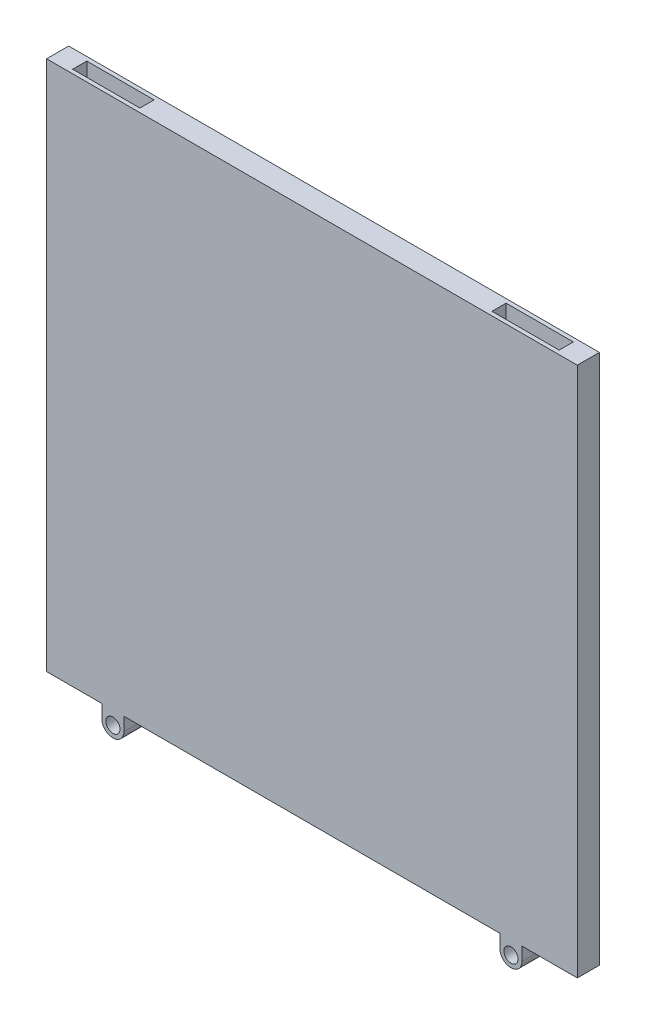
ISO-10303-21;
HEADER;
FILE_DESCRIPTION(('STEP AP214'),'2;1');
FILE_NAME('part.step','',(''),(''),'','','');
FILE_SCHEMA(('AUTOMOTIVE_DESIGN { 1 0 10303 214 1 1 1 1 }'));
ENDSEC;
DATA;
#1=APPLICATION_CONTEXT('core data for automotive mechanical design processes');
#2=APPLICATION_PROTOCOL_DEFINITION('international standard','automotive_design',2000,#1);
#3=PRODUCT_CONTEXT('',#1,'mechanical');
#4=PRODUCT('Part','Part','',(#3));
#5=PRODUCT_RELATED_PRODUCT_CATEGORY('part','',(#4));
#6=PRODUCT_DEFINITION_FORMATION('','',#4);
#7=PRODUCT_DEFINITION_CONTEXT('part definition',#1,'design');
#8=PRODUCT_DEFINITION('design','',#6,#7);
#9=PRODUCT_DEFINITION_SHAPE('','',#8);
#10=(LENGTH_UNIT() NAMED_UNIT(*) SI_UNIT(.MILLI.,.METRE.));
#11=(NAMED_UNIT(*) PLANE_ANGLE_UNIT() SI_UNIT($,.RADIAN.));
#12=(NAMED_UNIT(*) SI_UNIT($,.STERADIAN.) SOLID_ANGLE_UNIT());
#13=UNCERTAINTY_MEASURE_WITH_UNIT(LENGTH_MEASURE(1.E-05),#10,'distance_accuracy_value','');
#14=(GEOMETRIC_REPRESENTATION_CONTEXT(3) GLOBAL_UNCERTAINTY_ASSIGNED_CONTEXT((#13)) GLOBAL_UNIT_ASSIGNED_CONTEXT((#10,
#11,#12)) REPRESENTATION_CONTEXT('',''));
#15=CARTESIAN_POINT('',(0.,0.,0.));
#16=DIRECTION('',(0.,0.,1.));
#17=DIRECTION('',(1.,0.,0.));
#18=AXIS2_PLACEMENT_3D('',#15,#16,#17);
#19=CARTESIAN_POINT('',(60.,-60.,2.5));
#20=DIRECTION('',(0.,-1.,0.));
#21=DIRECTION('',(1.,0.,0.));
#22=AXIS2_PLACEMENT_3D('',#19,#20,#21);
#23=PLANE('',#22);
#24=DIRECTION('',(-1.,0.,0.));
#25=VECTOR('',#24,1.);
#26=CARTESIAN_POINT('',(60.,-60.,-2.5));
#27=LINE('',#26,#25);
#28=CARTESIAN_POINT('',(-47.5,-60.,-2.5));
#29=VERTEX_POINT('',#28);
#30=CARTESIAN_POINT('',(-60.,-60.,-2.5));
#31=VERTEX_POINT('',#30);
#32=EDGE_CURVE('E202',#29,#31,#27,.T.);
#33=ORIENTED_EDGE('',*,*,#32,.F.);
#34=DIRECTION('',(0.,0.,1.));
#35=VECTOR('',#34,1.);
#36=CARTESIAN_POINT('',(-47.5,-60.,-9.93303437365926));
#37=LINE('',#36,#35);
#38=CARTESIAN_POINT('',(-47.5,-60.,2.5));
#39=VERTEX_POINT('',#38);
#40=EDGE_CURVE('E193',#29,#39,#37,.T.);
#41=ORIENTED_EDGE('',*,*,#40,.T.);
#42=DIRECTION('',(-1.,0.,0.));
#43=VECTOR('',#42,1.);
#44=CARTESIAN_POINT('',(60.,-60.,2.5));
#45=LINE('',#44,#43);
#46=CARTESIAN_POINT('',(-60.,-60.,2.5));
#47=VERTEX_POINT('',#46);
#48=EDGE_CURVE('E216',#39,#47,#45,.T.);
#49=ORIENTED_EDGE('',*,*,#48,.T.);
#50=DIRECTION('',(0.,0.,-1.));
#51=VECTOR('',#50,1.);
#52=CARTESIAN_POINT('',(-60.,-60.,2.5));
#53=LINE('',#52,#51);
#54=EDGE_CURVE('E40',#47,#31,#53,.T.);
#55=ORIENTED_EDGE('',*,*,#54,.T.);
#56=EDGE_LOOP('',(#33,#41,#49,#55));
#57=FACE_BOUND('',#56,.T.);
#58=ADVANCED_FACE('F36',(#57),#23,.T.);
#59=CARTESIAN_POINT('',(42.5,-60.,2.5));
#60=VERTEX_POINT('',#59);
#61=CARTESIAN_POINT('',(-42.5,-60.,2.5));
#62=VERTEX_POINT('',#61);
#63=EDGE_CURVE('E192',#60,#62,#45,.T.);
#64=ORIENTED_EDGE('',*,*,#63,.T.);
#65=DIRECTION('',(0.,0.,1.));
#66=VECTOR('',#65,1.);
#67=CARTESIAN_POINT('',(-42.5,-60.,-9.93303437365926));
#68=LINE('',#67,#66);
#69=CARTESIAN_POINT('',(-42.5,-60.,-2.5));
#70=VERTEX_POINT('',#69);
#71=EDGE_CURVE('E179',#70,#62,#68,.T.);
#72=ORIENTED_EDGE('',*,*,#71,.F.);
#73=CARTESIAN_POINT('',(42.5,-60.,-2.5));
#74=VERTEX_POINT('',#73);
#75=EDGE_CURVE('E190',#74,#70,#27,.T.);
#76=ORIENTED_EDGE('',*,*,#75,.F.);
#77=DIRECTION('',(0.,0.,1.));
#78=VECTOR('',#77,1.);
#79=CARTESIAN_POINT('',(42.5,-60.,-9.93303437365926));
#80=LINE('',#79,#78);
#81=EDGE_CURVE('E307',#74,#60,#80,.T.);
#82=ORIENTED_EDGE('',*,*,#81,.T.);
#83=EDGE_LOOP('',(#64,#72,#76,#82));
#84=FACE_BOUND('',#83,.T.);
#85=ADVANCED_FACE('F189',(#84),#23,.T.);
#86=DIRECTION('',(0.,0.,1.));
#87=VECTOR('',#86,1.);
#88=CARTESIAN_POINT('',(47.5,-60.,-9.93303437365926));
#89=LINE('',#88,#87);
#90=CARTESIAN_POINT('',(47.5,-60.,-2.5));
#91=VERTEX_POINT('',#90);
#92=CARTESIAN_POINT('',(47.5,-60.,2.5));
#93=VERTEX_POINT('',#92);
#94=EDGE_CURVE('E312',#91,#93,#89,.T.);
#95=ORIENTED_EDGE('',*,*,#94,.F.);
#96=CARTESIAN_POINT('',(60.,-60.,-2.5));
#97=VERTEX_POINT('',#96);
#98=EDGE_CURVE('E201',#97,#91,#27,.T.);
#99=ORIENTED_EDGE('',*,*,#98,.F.);
#100=DIRECTION('',(0.,0.,-1.));
#101=VECTOR('',#100,1.);
#102=CARTESIAN_POINT('',(60.,-60.,2.5));
#103=LINE('',#102,#101);
#104=CARTESIAN_POINT('',(60.,-60.,2.5));
#105=VERTEX_POINT('',#104);
#106=EDGE_CURVE('E11',#105,#97,#103,.T.);
#107=ORIENTED_EDGE('',*,*,#106,.F.);
#108=EDGE_CURVE('E236',#105,#93,#45,.T.);
#109=ORIENTED_EDGE('',*,*,#108,.T.);
#110=EDGE_LOOP('',(#95,#99,#107,#109));
#111=FACE_BOUND('',#110,.T.);
#112=ADVANCED_FACE('F38',(#111),#23,.T.);
#113=CARTESIAN_POINT('',(60.,-60.,2.5));
#114=DIRECTION('',(-1.,0.,0.));
#115=DIRECTION('',(0.,0.,1.));
#116=AXIS2_PLACEMENT_3D('',#113,#114,#115);
#117=PLANE('',#116);
#118=DIRECTION('',(0.,1.,0.));
#119=VECTOR('',#118,1.);
#120=CARTESIAN_POINT('',(60.,-60.,-2.5));
#121=LINE('',#120,#119);
#122=CARTESIAN_POINT('',(60.,60.,-2.5));
#123=VERTEX_POINT('',#122);
#124=EDGE_CURVE('E215',#97,#123,#121,.T.);
#125=ORIENTED_EDGE('',*,*,#124,.T.);
#126=DIRECTION('',(0.,0.,-1.));
#127=VECTOR('',#126,1.);
#128=CARTESIAN_POINT('',(60.,60.,2.5));
#129=LINE('',#128,#127);
#130=CARTESIAN_POINT('',(60.,60.,2.5));
#131=VERTEX_POINT('',#130);
#132=EDGE_CURVE('E45',#131,#123,#129,.T.);
#133=ORIENTED_EDGE('',*,*,#132,.F.);
#134=DIRECTION('',(0.,1.,0.));
#135=VECTOR('',#134,1.);
#136=CARTESIAN_POINT('',(60.,-60.,2.5));
#137=LINE('',#136,#135);
#138=EDGE_CURVE('E208',#105,#131,#137,.T.);
#139=ORIENTED_EDGE('',*,*,#138,.F.);
#140=ORIENTED_EDGE('',*,*,#106,.T.);
#141=EDGE_LOOP('',(#125,#133,#139,#140));
#142=FACE_BOUND('',#141,.T.);
#143=ADVANCED_FACE('F373',(#142),#117,.F.);
#144=CARTESIAN_POINT('',(60.,60.,2.5));
#145=DIRECTION('',(0.,-1.,0.));
#146=DIRECTION('',(1.,0.,0.));
#147=AXIS2_PLACEMENT_3D('',#144,#145,#146);
#148=PLANE('',#147);
#149=DIRECTION('',(-1.,0.,0.));
#150=VECTOR('',#149,1.);
#151=CARTESIAN_POINT('',(-55.,60.,-1.6));
#152=LINE('',#151,#150);
#153=CARTESIAN_POINT('',(-39.8,60.,-1.6));
#154=VERTEX_POINT('',#153);
#155=CARTESIAN_POINT('',(-55.,60.,-1.6));
#156=VERTEX_POINT('',#155);
#157=EDGE_CURVE('E291',#154,#156,#152,.T.);
#158=ORIENTED_EDGE('',*,*,#157,.F.);
#159=DIRECTION('',(0.,0.,-1.));
#160=VECTOR('',#159,1.);
#161=CARTESIAN_POINT('',(-39.8,60.,1.6));
#162=LINE('',#161,#160);
#163=CARTESIAN_POINT('',(-39.8,60.,1.6));
#164=VERTEX_POINT('',#163);
#165=EDGE_CURVE('E257',#164,#154,#162,.T.);
#166=ORIENTED_EDGE('',*,*,#165,.F.);
#167=DIRECTION('',(1.,0.,0.));
#168=VECTOR('',#167,1.);
#169=CARTESIAN_POINT('',(-55.,60.,1.6));
#170=LINE('',#169,#168);
#171=CARTESIAN_POINT('',(-55.,60.,1.6));
#172=VERTEX_POINT('',#171);
#173=EDGE_CURVE('E284',#172,#164,#170,.T.);
#174=ORIENTED_EDGE('',*,*,#173,.F.);
#175=DIRECTION('',(0.,0.,1.));
#176=VECTOR('',#175,1.);
#177=CARTESIAN_POINT('',(-55.,60.,1.6));
#178=LINE('',#177,#176);
#179=EDGE_CURVE('E288',#156,#172,#178,.T.);
#180=ORIENTED_EDGE('',*,*,#179,.F.);
#181=EDGE_LOOP('',(#158,#166,#174,#180));
#182=FACE_BOUND('',#181,.T.);
#183=DIRECTION('',(-1.,0.,0.));
#184=VECTOR('',#183,1.);
#185=CARTESIAN_POINT('',(55.,60.,-1.6));
#186=LINE('',#185,#184);
#187=CARTESIAN_POINT('',(55.,60.,-1.6));
#188=VERTEX_POINT('',#187);
#189=CARTESIAN_POINT('',(39.8,60.,-1.6));
#190=VERTEX_POINT('',#189);
#191=EDGE_CURVE('E258',#188,#190,#186,.T.);
#192=ORIENTED_EDGE('',*,*,#191,.F.);
#193=DIRECTION('',(0.,0.,-1.));
#194=VECTOR('',#193,1.);
#195=CARTESIAN_POINT('',(55.,60.,1.6));
#196=LINE('',#195,#194);
#197=CARTESIAN_POINT('',(55.,60.,1.6));
#198=VERTEX_POINT('',#197);
#199=EDGE_CURVE('E255',#198,#188,#196,.T.);
#200=ORIENTED_EDGE('',*,*,#199,.F.);
#201=DIRECTION('',(1.,0.,0.));
#202=VECTOR('',#201,1.);
#203=CARTESIAN_POINT('',(55.,60.,1.6));
#204=LINE('',#203,#202);
#205=CARTESIAN_POINT('',(39.8,60.,1.6));
#206=VERTEX_POINT('',#205);
#207=EDGE_CURVE('E244',#206,#198,#204,.T.);
#208=ORIENTED_EDGE('',*,*,#207,.F.);
#209=DIRECTION('',(0.,0.,1.));
#210=VECTOR('',#209,1.);
#211=CARTESIAN_POINT('',(39.8,60.,1.6));
#212=LINE('',#211,#210);
#213=EDGE_CURVE('E261',#190,#206,#212,.T.);
#214=ORIENTED_EDGE('',*,*,#213,.F.);
#215=EDGE_LOOP('',(#192,#200,#208,#214));
#216=FACE_BOUND('',#215,.T.);
#217=DIRECTION('',(-1.,0.,0.));
#218=VECTOR('',#217,1.);
#219=CARTESIAN_POINT('',(60.,60.,-2.5));
#220=LINE('',#219,#218);
#221=CARTESIAN_POINT('',(-60.,60.,-2.5));
#222=VERTEX_POINT('',#221);
#223=EDGE_CURVE('E212',#123,#222,#220,.T.);
#224=ORIENTED_EDGE('',*,*,#223,.T.);
#225=DIRECTION('',(0.,0.,-1.));
#226=VECTOR('',#225,1.);
#227=CARTESIAN_POINT('',(-60.,60.,2.5));
#228=LINE('',#227,#226);
#229=CARTESIAN_POINT('',(-60.,60.,2.5));
#230=VERTEX_POINT('',#229);
#231=EDGE_CURVE('E219',#230,#222,#228,.T.);
#232=ORIENTED_EDGE('',*,*,#231,.F.);
#233=DIRECTION('',(-1.,0.,0.));
#234=VECTOR('',#233,1.);
#235=CARTESIAN_POINT('',(60.,60.,2.5));
#236=LINE('',#235,#234);
#237=EDGE_CURVE('E228',#131,#230,#236,.T.);
#238=ORIENTED_EDGE('',*,*,#237,.F.);
#239=ORIENTED_EDGE('',*,*,#132,.T.);
#240=EDGE_LOOP('',(#224,#232,#238,#239));
#241=FACE_BOUND('',#240,.T.);
#242=ADVANCED_FACE('F375',(#182,#216,#241),#148,.F.);
#243=CARTESIAN_POINT('',(-60.,-60.,2.5));
#244=DIRECTION('',(-1.,0.,0.));
#245=DIRECTION('',(0.,0.,1.));
#246=AXIS2_PLACEMENT_3D('',#243,#244,#245);
#247=PLANE('',#246);
#248=DIRECTION('',(0.,1.,0.));
#249=VECTOR('',#248,1.);
#250=CARTESIAN_POINT('',(-60.,-60.,-2.5));
#251=LINE('',#250,#249);
#252=EDGE_CURVE('E204',#31,#222,#251,.T.);
#253=ORIENTED_EDGE('',*,*,#252,.F.);
#254=ORIENTED_EDGE('',*,*,#54,.F.);
#255=DIRECTION('',(0.,1.,0.));
#256=VECTOR('',#255,1.);
#257=CARTESIAN_POINT('',(-60.,-60.,2.5));
#258=LINE('',#257,#256);
#259=EDGE_CURVE('E233',#47,#230,#258,.T.);
#260=ORIENTED_EDGE('',*,*,#259,.T.);
#261=ORIENTED_EDGE('',*,*,#231,.T.);
#262=EDGE_LOOP('',(#253,#254,#260,#261));
#263=FACE_BOUND('',#262,.T.);
#264=ADVANCED_FACE('F358',(#263),#247,.T.);
#265=CARTESIAN_POINT('',(0.,0.,2.5));
#266=DIRECTION('',(0.,0.,-1.));
#267=DIRECTION('',(-1.,0.,0.));
#268=AXIS2_PLACEMENT_3D('',#265,#266,#267);
#269=PLANE('',#268);
#270=ORIENTED_EDGE('',*,*,#108,.F.);
#271=ORIENTED_EDGE('',*,*,#138,.T.);
#272=ORIENTED_EDGE('',*,*,#237,.T.);
#273=ORIENTED_EDGE('',*,*,#259,.F.);
#274=ORIENTED_EDGE('',*,*,#48,.F.);
#275=DIRECTION('',(0.,1.,0.));
#276=VECTOR('',#275,1.);
#277=CARTESIAN_POINT('',(-47.5,-60.,2.5));
#278=LINE('',#277,#276);
#279=CARTESIAN_POINT('',(-47.5,-63.,2.5));
#280=VERTEX_POINT('',#279);
#281=EDGE_CURVE('E341',#280,#39,#278,.T.);
#282=ORIENTED_EDGE('',*,*,#281,.F.);
#283=CARTESIAN_POINT('',(-45.,-63.,2.5));
#284=DIRECTION('',(0.,0.,-1.));
#285=DIRECTION('',(-1.,0.,0.));
#286=AXIS2_PLACEMENT_3D('',#283,#284,#285);
#287=CIRCLE('',#286,2.5);
#288=CARTESIAN_POINT('',(-42.5,-63.,2.5));
#289=VERTEX_POINT('',#288);
#290=EDGE_CURVE('E194',#289,#280,#287,.T.);
#291=ORIENTED_EDGE('',*,*,#290,.F.);
#292=DIRECTION('',(0.,-1.,0.));
#293=VECTOR('',#292,1.);
#294=CARTESIAN_POINT('',(-42.5,-60.,2.5));
#295=LINE('',#294,#293);
#296=EDGE_CURVE('E343',#62,#289,#295,.T.);
#297=ORIENTED_EDGE('',*,*,#296,.F.);
#298=ORIENTED_EDGE('',*,*,#63,.F.);
#299=DIRECTION('',(0.,-1.,0.));
#300=VECTOR('',#299,1.);
#301=CARTESIAN_POINT('',(42.5,-60.,2.5));
#302=LINE('',#301,#300);
#303=CARTESIAN_POINT('',(42.5,-63.,2.5));
#304=VERTEX_POINT('',#303);
#305=EDGE_CURVE('E61',#60,#304,#302,.T.);
#306=ORIENTED_EDGE('',*,*,#305,.T.);
#307=CARTESIAN_POINT('',(45.,-63.,2.5));
#308=DIRECTION('',(0.,0.,1.));
#309=DIRECTION('',(1.,0.,0.));
#310=AXIS2_PLACEMENT_3D('',#307,#308,#309);
#311=CIRCLE('',#310,2.5);
#312=CARTESIAN_POINT('',(47.5,-63.,2.5));
#313=VERTEX_POINT('',#312);
#314=EDGE_CURVE('E326',#304,#313,#311,.T.);
#315=ORIENTED_EDGE('',*,*,#314,.T.);
#316=DIRECTION('',(0.,1.,0.));
#317=VECTOR('',#316,1.);
#318=CARTESIAN_POINT('',(47.5,-60.,2.5));
#319=LINE('',#318,#317);
#320=EDGE_CURVE('E322',#313,#93,#319,.T.);
#321=ORIENTED_EDGE('',*,*,#320,.T.);
#322=EDGE_LOOP('',(#270,#271,#272,#273,#274,#282,#291,#297,#298,#306,#315,#321));
#323=FACE_BOUND('',#322,.T.);
#324=CARTESIAN_POINT('',(45.,-63.,2.5));
#325=DIRECTION('',(0.,0.,1.));
#326=DIRECTION('',(1.,0.,0.));
#327=AXIS2_PLACEMENT_3D('',#324,#325,#326);
#328=CIRCLE('',#327,1.6);
#329=CARTESIAN_POINT('',(46.6,-63.,2.5));
#330=VERTEX_POINT('',#329);
#331=EDGE_CURVE('E310',#330,#330,#328,.T.);
#332=ORIENTED_EDGE('',*,*,#331,.F.);
#333=EDGE_LOOP('',(#332));
#334=FACE_BOUND('',#333,.T.);
#335=CARTESIAN_POINT('',(-45.,-63.,2.5));
#336=DIRECTION('',(0.,0.,-1.));
#337=DIRECTION('',(-1.,0.,0.));
#338=AXIS2_PLACEMENT_3D('',#335,#336,#337);
#339=CIRCLE('',#338,1.6);
#340=CARTESIAN_POINT('',(-46.6,-63.,2.5));
#341=VERTEX_POINT('',#340);
#342=EDGE_CURVE('E183',#341,#341,#339,.T.);
#343=ORIENTED_EDGE('',*,*,#342,.T.);
#344=EDGE_LOOP('',(#343));
#345=FACE_BOUND('',#344,.T.);
#346=ADVANCED_FACE('F359',(#323,#334,#345),#269,.F.);
#347=CARTESIAN_POINT('',(0.,0.,-2.5));
#348=DIRECTION('',(0.,0.,-1.));
#349=DIRECTION('',(-1.,0.,0.));
#350=AXIS2_PLACEMENT_3D('',#347,#348,#349);
#351=PLANE('',#350);
#352=ORIENTED_EDGE('',*,*,#98,.T.);
#353=DIRECTION('',(0.,1.,0.));
#354=VECTOR('',#353,1.);
#355=CARTESIAN_POINT('',(47.5,-60.,-2.5));
#356=LINE('',#355,#354);
#357=CARTESIAN_POINT('',(47.5,-63.,-2.5));
#358=VERTEX_POINT('',#357);
#359=EDGE_CURVE('E314',#358,#91,#356,.T.);
#360=ORIENTED_EDGE('',*,*,#359,.F.);
#361=CARTESIAN_POINT('',(45.,-63.,-2.5));
#362=DIRECTION('',(0.,0.,-1.));
#363=DIRECTION('',(-1.,0.,0.));
#364=AXIS2_PLACEMENT_3D('',#361,#362,#363);
#365=CIRCLE('',#364,2.5);
#366=CARTESIAN_POINT('',(42.5,-63.,-2.5));
#367=VERTEX_POINT('',#366);
#368=EDGE_CURVE('E311',#367,#358,#365,.F.);
#369=ORIENTED_EDGE('',*,*,#368,.F.);
#370=DIRECTION('',(0.,-1.,0.));
#371=VECTOR('',#370,1.);
#372=CARTESIAN_POINT('',(42.5,-60.,-2.5));
#373=LINE('',#372,#371);
#374=EDGE_CURVE('E200',#74,#367,#373,.T.);
#375=ORIENTED_EDGE('',*,*,#374,.F.);
#376=ORIENTED_EDGE('',*,*,#75,.T.);
#377=DIRECTION('',(0.,-1.,0.));
#378=VECTOR('',#377,1.);
#379=CARTESIAN_POINT('',(-42.5,-60.,-2.5));
#380=LINE('',#379,#378);
#381=CARTESIAN_POINT('',(-42.5,-63.,-2.5));
#382=VERTEX_POINT('',#381);
#383=EDGE_CURVE('E175',#70,#382,#380,.T.);
#384=ORIENTED_EDGE('',*,*,#383,.T.);
#385=CARTESIAN_POINT('',(-45.,-63.,-2.5));
#386=DIRECTION('',(0.,0.,-1.));
#387=DIRECTION('',(-1.,0.,0.));
#388=AXIS2_PLACEMENT_3D('',#385,#386,#387);
#389=CIRCLE('',#388,2.5);
#390=CARTESIAN_POINT('',(-47.5,-63.,-2.5));
#391=VERTEX_POINT('',#390);
#392=EDGE_CURVE('E184',#382,#391,#389,.T.);
#393=ORIENTED_EDGE('',*,*,#392,.T.);
#394=DIRECTION('',(0.,1.,0.));
#395=VECTOR('',#394,1.);
#396=CARTESIAN_POINT('',(-47.5,-60.,-2.5));
#397=LINE('',#396,#395);
#398=EDGE_CURVE('E53',#391,#29,#397,.T.);
#399=ORIENTED_EDGE('',*,*,#398,.T.);
#400=ORIENTED_EDGE('',*,*,#32,.T.);
#401=ORIENTED_EDGE('',*,*,#252,.T.);
#402=ORIENTED_EDGE('',*,*,#223,.F.);
#403=ORIENTED_EDGE('',*,*,#124,.F.);
#404=EDGE_LOOP('',(#352,#360,#369,#375,#376,#384,#393,#399,#400,#401,#402,#403));
#405=FACE_BOUND('',#404,.T.);
#406=CARTESIAN_POINT('',(45.,-63.,-2.5));
#407=DIRECTION('',(0.,0.,-1.));
#408=DIRECTION('',(-1.,0.,0.));
#409=AXIS2_PLACEMENT_3D('',#406,#407,#408);
#410=CIRCLE('',#409,1.6);
#411=CARTESIAN_POINT('',(43.4,-63.,-2.5));
#412=VERTEX_POINT('',#411);
#413=EDGE_CURVE('E269',#412,#412,#410,.F.);
#414=ORIENTED_EDGE('',*,*,#413,.T.);
#415=EDGE_LOOP('',(#414));
#416=FACE_BOUND('',#415,.T.);
#417=CARTESIAN_POINT('',(-45.,-63.,-2.5));
#418=DIRECTION('',(0.,0.,-1.));
#419=DIRECTION('',(-1.,0.,0.));
#420=AXIS2_PLACEMENT_3D('',#417,#418,#419);
#421=CIRCLE('',#420,1.6);
#422=CARTESIAN_POINT('',(-46.6,-63.,-2.5));
#423=VERTEX_POINT('',#422);
#424=EDGE_CURVE('E331',#423,#423,#421,.T.);
#425=ORIENTED_EDGE('',*,*,#424,.F.);
#426=EDGE_LOOP('',(#425));
#427=FACE_BOUND('',#426,.T.);
#428=ADVANCED_FACE('F197',(#405,#416,#427),#351,.T.);
#429=CARTESIAN_POINT('',(55.,40.,1.6));
#430=DIRECTION('',(1.,0.,0.));
#431=DIRECTION('',(0.,1.,0.));
#432=AXIS2_PLACEMENT_3D('',#429,#430,#431);
#433=PLANE('',#432);
#434=ORIENTED_EDGE('',*,*,#199,.T.);
#435=DIRECTION('',(0.,1.,0.));
#436=VECTOR('',#435,1.);
#437=CARTESIAN_POINT('',(55.,40.,-1.6));
#438=LINE('',#437,#436);
#439=CARTESIAN_POINT('',(55.,40.,-1.6));
#440=VERTEX_POINT('',#439);
#441=EDGE_CURVE('E254',#440,#188,#438,.T.);
#442=ORIENTED_EDGE('',*,*,#441,.F.);
#443=DIRECTION('',(0.,0.,-1.));
#444=VECTOR('',#443,1.);
#445=CARTESIAN_POINT('',(55.,40.,1.6));
#446=LINE('',#445,#444);
#447=CARTESIAN_POINT('',(55.,40.,1.6));
#448=VERTEX_POINT('',#447);
#449=EDGE_CURVE('E241',#448,#440,#446,.T.);
#450=ORIENTED_EDGE('',*,*,#449,.F.);
#451=DIRECTION('',(0.,1.,0.));
#452=VECTOR('',#451,1.);
#453=CARTESIAN_POINT('',(55.,40.,1.6));
#454=LINE('',#453,#452);
#455=EDGE_CURVE('E266',#448,#198,#454,.T.);
#456=ORIENTED_EDGE('',*,*,#455,.T.);
#457=EDGE_LOOP('',(#434,#442,#450,#456));
#458=FACE_BOUND('',#457,.T.);
#459=ADVANCED_FACE('F421',(#458),#433,.F.);
#460=CARTESIAN_POINT('',(55.,40.,1.6));
#461=DIRECTION('',(0.,0.,1.));
#462=DIRECTION('',(1.,0.,0.));
#463=AXIS2_PLACEMENT_3D('',#460,#461,#462);
#464=PLANE('',#463);
#465=ORIENTED_EDGE('',*,*,#207,.T.);
#466=ORIENTED_EDGE('',*,*,#455,.F.);
#467=DIRECTION('',(1.,0.,0.));
#468=VECTOR('',#467,1.);
#469=CARTESIAN_POINT('',(55.,40.,1.6));
#470=LINE('',#469,#468);
#471=CARTESIAN_POINT('',(39.8,40.,1.6));
#472=VERTEX_POINT('',#471);
#473=EDGE_CURVE('E251',#472,#448,#470,.T.);
#474=ORIENTED_EDGE('',*,*,#473,.F.);
#475=DIRECTION('',(0.,1.,0.));
#476=VECTOR('',#475,1.);
#477=CARTESIAN_POINT('',(39.8,40.,1.6));
#478=LINE('',#477,#476);
#479=EDGE_CURVE('E268',#472,#206,#478,.T.);
#480=ORIENTED_EDGE('',*,*,#479,.T.);
#481=EDGE_LOOP('',(#465,#466,#474,#480));
#482=FACE_BOUND('',#481,.T.);
#483=ADVANCED_FACE('F426',(#482),#464,.F.);
#484=CARTESIAN_POINT('',(39.8,40.,1.6));
#485=DIRECTION('',(-1.,0.,0.));
#486=DIRECTION('',(0.,-1.,0.));
#487=AXIS2_PLACEMENT_3D('',#484,#485,#486);
#488=PLANE('',#487);
#489=ORIENTED_EDGE('',*,*,#213,.T.);
#490=ORIENTED_EDGE('',*,*,#479,.F.);
#491=DIRECTION('',(0.,0.,1.));
#492=VECTOR('',#491,1.);
#493=CARTESIAN_POINT('',(39.8,40.,1.6));
#494=LINE('',#493,#492);
#495=CARTESIAN_POINT('',(39.8,40.,-1.6));
#496=VERTEX_POINT('',#495);
#497=EDGE_CURVE('E248',#496,#472,#494,.T.);
#498=ORIENTED_EDGE('',*,*,#497,.F.);
#499=DIRECTION('',(0.,1.,0.));
#500=VECTOR('',#499,1.);
#501=CARTESIAN_POINT('',(39.8,40.,-1.6));
#502=LINE('',#501,#500);
#503=EDGE_CURVE('E271',#496,#190,#502,.T.);
#504=ORIENTED_EDGE('',*,*,#503,.T.);
#505=EDGE_LOOP('',(#489,#490,#498,#504));
#506=FACE_BOUND('',#505,.T.);
#507=ADVANCED_FACE('F439',(#506),#488,.F.);
#508=CARTESIAN_POINT('',(55.,40.,-1.6));
#509=DIRECTION('',(0.,0.,-1.));
#510=DIRECTION('',(-1.,0.,0.));
#511=AXIS2_PLACEMENT_3D('',#508,#509,#510);
#512=PLANE('',#511);
#513=ORIENTED_EDGE('',*,*,#191,.T.);
#514=ORIENTED_EDGE('',*,*,#503,.F.);
#515=DIRECTION('',(-1.,0.,0.));
#516=VECTOR('',#515,1.);
#517=CARTESIAN_POINT('',(55.,40.,-1.6));
#518=LINE('',#517,#516);
#519=EDGE_CURVE('E245',#440,#496,#518,.T.);
#520=ORIENTED_EDGE('',*,*,#519,.F.);
#521=ORIENTED_EDGE('',*,*,#441,.T.);
#522=EDGE_LOOP('',(#513,#514,#520,#521));
#523=FACE_BOUND('',#522,.T.);
#524=ADVANCED_FACE('F450',(#523),#512,.F.);
#525=CARTESIAN_POINT('',(0.,40.,0.));
#526=DIRECTION('',(0.,1.,0.));
#527=DIRECTION('',(0.,0.,1.));
#528=AXIS2_PLACEMENT_3D('',#525,#526,#527);
#529=PLANE('',#528);
#530=ORIENTED_EDGE('',*,*,#449,.T.);
#531=ORIENTED_EDGE('',*,*,#519,.T.);
#532=ORIENTED_EDGE('',*,*,#497,.T.);
#533=ORIENTED_EDGE('',*,*,#473,.T.);
#534=EDGE_LOOP('',(#530,#531,#532,#533));
#535=FACE_BOUND('',#534,.T.);
#536=ADVANCED_FACE('F461',(#535),#529,.T.);
#537=CARTESIAN_POINT('',(-39.8,40.,1.6));
#538=DIRECTION('',(1.,0.,0.));
#539=DIRECTION('',(0.,1.,0.));
#540=AXIS2_PLACEMENT_3D('',#537,#538,#539);
#541=PLANE('',#540);
#542=ORIENTED_EDGE('',*,*,#165,.T.);
#543=DIRECTION('',(0.,1.,0.));
#544=VECTOR('',#543,1.);
#545=CARTESIAN_POINT('',(-39.8,40.,-1.6));
#546=LINE('',#545,#544);
#547=CARTESIAN_POINT('',(-39.8,40.,-1.6));
#548=VERTEX_POINT('',#547);
#549=EDGE_CURVE('E275',#548,#154,#546,.T.);
#550=ORIENTED_EDGE('',*,*,#549,.F.);
#551=DIRECTION('',(0.,0.,-1.));
#552=VECTOR('',#551,1.);
#553=CARTESIAN_POINT('',(-39.8,40.,1.6));
#554=LINE('',#553,#552);
#555=CARTESIAN_POINT('',(-39.8,40.,1.6));
#556=VERTEX_POINT('',#555);
#557=EDGE_CURVE('E287',#556,#548,#554,.T.);
#558=ORIENTED_EDGE('',*,*,#557,.F.);
#559=DIRECTION('',(0.,1.,0.));
#560=VECTOR('',#559,1.);
#561=CARTESIAN_POINT('',(-39.8,40.,1.6));
#562=LINE('',#561,#560);
#563=EDGE_CURVE('E205',#556,#164,#562,.T.);
#564=ORIENTED_EDGE('',*,*,#563,.T.);
#565=EDGE_LOOP('',(#542,#550,#558,#564));
#566=FACE_BOUND('',#565,.T.);
#567=ADVANCED_FACE('F472',(#566),#541,.F.);
#568=CARTESIAN_POINT('',(-55.,40.,1.6));
#569=DIRECTION('',(0.,0.,1.));
#570=DIRECTION('',(1.,0.,0.));
#571=AXIS2_PLACEMENT_3D('',#568,#569,#570);
#572=PLANE('',#571);
#573=ORIENTED_EDGE('',*,*,#173,.T.);
#574=ORIENTED_EDGE('',*,*,#563,.F.);
#575=DIRECTION('',(1.,0.,0.));
#576=VECTOR('',#575,1.);
#577=CARTESIAN_POINT('',(-55.,40.,1.6));
#578=LINE('',#577,#576);
#579=CARTESIAN_POINT('',(-55.,40.,1.6));
#580=VERTEX_POINT('',#579);
#581=EDGE_CURVE('E279',#580,#556,#578,.T.);
#582=ORIENTED_EDGE('',*,*,#581,.F.);
#583=DIRECTION('',(0.,1.,0.));
#584=VECTOR('',#583,1.);
#585=CARTESIAN_POINT('',(-55.,40.,1.6));
#586=LINE('',#585,#584);
#587=EDGE_CURVE('E281',#580,#172,#586,.T.);
#588=ORIENTED_EDGE('',*,*,#587,.T.);
#589=EDGE_LOOP('',(#573,#574,#582,#588));
#590=FACE_BOUND('',#589,.T.);
#591=ADVANCED_FACE('F483',(#590),#572,.F.);
#592=CARTESIAN_POINT('',(-55.,40.,1.6));
#593=DIRECTION('',(-1.,0.,0.));
#594=DIRECTION('',(0.,-1.,0.));
#595=AXIS2_PLACEMENT_3D('',#592,#593,#594);
#596=PLANE('',#595);
#597=ORIENTED_EDGE('',*,*,#179,.T.);
#598=ORIENTED_EDGE('',*,*,#587,.F.);
#599=DIRECTION('',(0.,0.,1.));
#600=VECTOR('',#599,1.);
#601=CARTESIAN_POINT('',(-55.,40.,1.6));
#602=LINE('',#601,#600);
#603=CARTESIAN_POINT('',(-55.,40.,-1.6));
#604=VERTEX_POINT('',#603);
#605=EDGE_CURVE('E297',#604,#580,#602,.T.);
#606=ORIENTED_EDGE('',*,*,#605,.F.);
#607=DIRECTION('',(0.,1.,0.));
#608=VECTOR('',#607,1.);
#609=CARTESIAN_POINT('',(-55.,40.,-1.6));
#610=LINE('',#609,#608);
#611=EDGE_CURVE('E278',#604,#156,#610,.T.);
#612=ORIENTED_EDGE('',*,*,#611,.T.);
#613=EDGE_LOOP('',(#597,#598,#606,#612));
#614=FACE_BOUND('',#613,.T.);
#615=ADVANCED_FACE('F494',(#614),#596,.F.);
#616=CARTESIAN_POINT('',(-55.,40.,-1.6));
#617=DIRECTION('',(0.,0.,-1.));
#618=DIRECTION('',(-1.,0.,0.));
#619=AXIS2_PLACEMENT_3D('',#616,#617,#618);
#620=PLANE('',#619);
#621=ORIENTED_EDGE('',*,*,#157,.T.);
#622=ORIENTED_EDGE('',*,*,#611,.F.);
#623=DIRECTION('',(-1.,0.,0.));
#624=VECTOR('',#623,1.);
#625=CARTESIAN_POINT('',(-55.,40.,-1.6));
#626=LINE('',#625,#624);
#627=EDGE_CURVE('E300',#548,#604,#626,.T.);
#628=ORIENTED_EDGE('',*,*,#627,.F.);
#629=ORIENTED_EDGE('',*,*,#549,.T.);
#630=EDGE_LOOP('',(#621,#622,#628,#629));
#631=FACE_BOUND('',#630,.T.);
#632=ADVANCED_FACE('F505',(#631),#620,.F.);
#633=CARTESIAN_POINT('',(0.,40.,0.));
#634=DIRECTION('',(0.,-1.,0.));
#635=DIRECTION('',(0.,0.,-1.));
#636=AXIS2_PLACEMENT_3D('',#633,#634,#635);
#637=PLANE('',#636);
#638=ORIENTED_EDGE('',*,*,#557,.T.);
#639=ORIENTED_EDGE('',*,*,#627,.T.);
#640=ORIENTED_EDGE('',*,*,#605,.T.);
#641=ORIENTED_EDGE('',*,*,#581,.T.);
#642=EDGE_LOOP('',(#638,#639,#640,#641));
#643=FACE_BOUND('',#642,.T.);
#644=ADVANCED_FACE('F515',(#643),#637,.F.);
#645=CARTESIAN_POINT('',(42.5,-60.,-9.93303437365926));
#646=DIRECTION('',(-1.,0.,0.));
#647=DIRECTION('',(0.,0.,1.));
#648=AXIS2_PLACEMENT_3D('',#645,#646,#647);
#649=PLANE('',#648);
#650=ORIENTED_EDGE('',*,*,#81,.F.);
#651=ORIENTED_EDGE('',*,*,#374,.T.);
#652=DIRECTION('',(0.,0.,1.));
#653=VECTOR('',#652,1.);
#654=CARTESIAN_POINT('',(42.5,-63.,-9.93303437365926));
#655=LINE('',#654,#653);
#656=EDGE_CURVE('E305',#367,#304,#655,.T.);
#657=ORIENTED_EDGE('',*,*,#656,.T.);
#658=ORIENTED_EDGE('',*,*,#305,.F.);
#659=EDGE_LOOP('',(#650,#651,#657,#658));
#660=FACE_BOUND('',#659,.T.);
#661=ADVANCED_FACE('F525',(#660),#649,.T.);
#662=CARTESIAN_POINT('',(47.5,-60.,-9.93303437365926));
#663=DIRECTION('',(1.,0.,0.));
#664=DIRECTION('',(0.,0.,-1.));
#665=AXIS2_PLACEMENT_3D('',#662,#663,#664);
#666=PLANE('',#665);
#667=DIRECTION('',(0.,0.,1.));
#668=VECTOR('',#667,1.);
#669=CARTESIAN_POINT('',(47.5,-63.,-9.93303437365926));
#670=LINE('',#669,#668);
#671=EDGE_CURVE('E308',#358,#313,#670,.T.);
#672=ORIENTED_EDGE('',*,*,#671,.F.);
#673=ORIENTED_EDGE('',*,*,#359,.T.);
#674=ORIENTED_EDGE('',*,*,#94,.T.);
#675=ORIENTED_EDGE('',*,*,#320,.F.);
#676=EDGE_LOOP('',(#672,#673,#674,#675));
#677=FACE_BOUND('',#676,.T.);
#678=ADVANCED_FACE('F368',(#677),#666,.T.);
#679=CARTESIAN_POINT('',(45.,-63.,-9.93303437365926));
#680=DIRECTION('',(0.,0.,1.));
#681=DIRECTION('',(1.,0.,0.));
#682=AXIS2_PLACEMENT_3D('',#679,#680,#681);
#683=CYLINDRICAL_SURFACE('',#682,2.5);
#684=ORIENTED_EDGE('',*,*,#656,.F.);
#685=ORIENTED_EDGE('',*,*,#368,.T.);
#686=ORIENTED_EDGE('',*,*,#671,.T.);
#687=ORIENTED_EDGE('',*,*,#314,.F.);
#688=EDGE_LOOP('',(#684,#685,#686,#687));
#689=FACE_BOUND('',#688,.T.);
#690=ADVANCED_FACE('F365',(#689),#683,.T.);
#691=CARTESIAN_POINT('',(45.,-63.,-9.93303437365926));
#692=DIRECTION('',(0.,0.,1.));
#693=DIRECTION('',(1.,0.,0.));
#694=AXIS2_PLACEMENT_3D('',#691,#692,#693);
#695=CYLINDRICAL_SURFACE('',#694,1.6);
#696=ORIENTED_EDGE('',*,*,#331,.T.);
#697=EDGE_LOOP('',(#696));
#698=FACE_BOUND('',#697,.T.);
#699=ORIENTED_EDGE('',*,*,#413,.F.);
#700=EDGE_LOOP('',(#699));
#701=FACE_BOUND('',#700,.T.);
#702=ADVANCED_FACE('F548',(#698,#701),#695,.F.);
#703=CARTESIAN_POINT('',(-47.5,-60.,-9.93303437365926));
#704=DIRECTION('',(1.,0.,0.));
#705=DIRECTION('',(0.,0.,-1.));
#706=AXIS2_PLACEMENT_3D('',#703,#704,#705);
#707=PLANE('',#706);
#708=ORIENTED_EDGE('',*,*,#398,.F.);
#709=DIRECTION('',(0.,0.,1.));
#710=VECTOR('',#709,1.);
#711=CARTESIAN_POINT('',(-47.5,-63.,-9.93303437365926));
#712=LINE('',#711,#710);
#713=EDGE_CURVE('E336',#391,#280,#712,.T.);
#714=ORIENTED_EDGE('',*,*,#713,.T.);
#715=ORIENTED_EDGE('',*,*,#281,.T.);
#716=ORIENTED_EDGE('',*,*,#40,.F.);
#717=EDGE_LOOP('',(#708,#714,#715,#716));
#718=FACE_BOUND('',#717,.T.);
#719=ADVANCED_FACE('F354',(#718),#707,.F.);
#720=CARTESIAN_POINT('',(-45.,-63.,-9.93303437365926));
#721=DIRECTION('',(0.,0.,1.));
#722=DIRECTION('',(1.,0.,0.));
#723=AXIS2_PLACEMENT_3D('',#720,#721,#722);
#724=CYLINDRICAL_SURFACE('',#723,2.5);
#725=ORIENTED_EDGE('',*,*,#392,.F.);
#726=DIRECTION('',(0.,0.,1.));
#727=VECTOR('',#726,1.);
#728=CARTESIAN_POINT('',(-42.5,-63.,-9.93303437365926));
#729=LINE('',#728,#727);
#730=EDGE_CURVE('E181',#382,#289,#729,.T.);
#731=ORIENTED_EDGE('',*,*,#730,.T.);
#732=ORIENTED_EDGE('',*,*,#290,.T.);
#733=ORIENTED_EDGE('',*,*,#713,.F.);
#734=EDGE_LOOP('',(#725,#731,#732,#733));
#735=FACE_BOUND('',#734,.T.);
#736=ADVANCED_FACE('F350',(#735),#724,.T.);
#737=CARTESIAN_POINT('',(-42.5,-60.,-9.93303437365926));
#738=DIRECTION('',(-1.,0.,0.));
#739=DIRECTION('',(0.,0.,1.));
#740=AXIS2_PLACEMENT_3D('',#737,#738,#739);
#741=PLANE('',#740);
#742=ORIENTED_EDGE('',*,*,#383,.F.);
#743=ORIENTED_EDGE('',*,*,#71,.T.);
#744=ORIENTED_EDGE('',*,*,#296,.T.);
#745=ORIENTED_EDGE('',*,*,#730,.F.);
#746=EDGE_LOOP('',(#742,#743,#744,#745));
#747=FACE_BOUND('',#746,.T.);
#748=ADVANCED_FACE('F177',(#747),#741,.F.);
#749=CARTESIAN_POINT('',(-45.,-63.,-9.93303437365926));
#750=DIRECTION('',(0.,0.,1.));
#751=DIRECTION('',(1.,0.,0.));
#752=AXIS2_PLACEMENT_3D('',#749,#750,#751);
#753=CYLINDRICAL_SURFACE('',#752,1.6);
#754=ORIENTED_EDGE('',*,*,#342,.F.);
#755=EDGE_LOOP('',(#754));
#756=FACE_BOUND('',#755,.T.);
#757=ORIENTED_EDGE('',*,*,#424,.T.);
#758=EDGE_LOOP('',(#757));
#759=FACE_BOUND('',#758,.T.);
#760=ADVANCED_FACE('F575',(#756,#759),#753,.F.);
#761=CLOSED_SHELL('',(#58,#85,#112,#143,#242,#264,#346,#428,#459,#483,#507,#524,#536,#567,#591,
#615,#632,#644,#661,#678,#690,#702,#719,#736,#748,#760));
#762=MANIFOLD_SOLID_BREP('B2',#761);
#763=ADVANCED_BREP_SHAPE_REPRESENTATION('',(#18,#762),#14);
#764=SHAPE_DEFINITION_REPRESENTATION(#9,#763);
ENDSEC;
END-ISO-10303-21;
